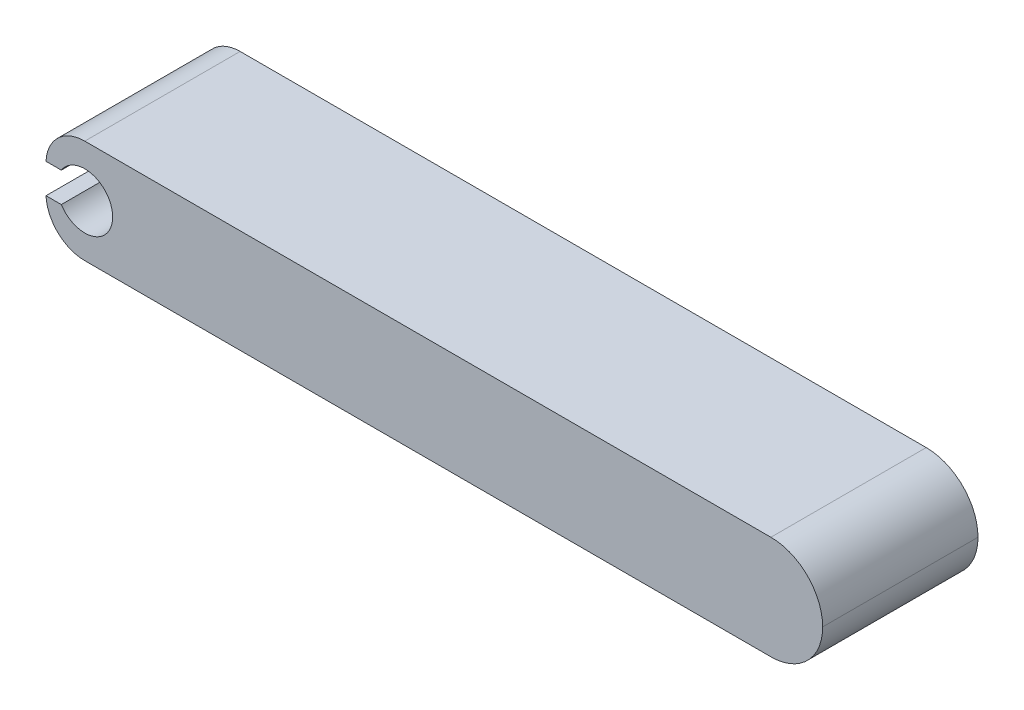
ISO-10303-21;
HEADER;
FILE_DESCRIPTION(('STEP AP214'),'2;1');
FILE_NAME('part.step','',(''),(''),'','','');
FILE_SCHEMA(('AUTOMOTIVE_DESIGN { 1 0 10303 214 1 1 1 1 }'));
ENDSEC;
DATA;
#1=APPLICATION_CONTEXT('core data for automotive mechanical design processes');
#2=APPLICATION_PROTOCOL_DEFINITION('international standard','automotive_design',2000,#1);
#3=PRODUCT_CONTEXT('',#1,'mechanical');
#4=PRODUCT('Part','Part','',(#3));
#5=PRODUCT_RELATED_PRODUCT_CATEGORY('part','',(#4));
#6=PRODUCT_DEFINITION_FORMATION('','',#4);
#7=PRODUCT_DEFINITION_CONTEXT('part definition',#1,'design');
#8=PRODUCT_DEFINITION('design','',#6,#7);
#9=PRODUCT_DEFINITION_SHAPE('','',#8);
#10=(LENGTH_UNIT() NAMED_UNIT(*) SI_UNIT(.MILLI.,.METRE.));
#11=(NAMED_UNIT(*) PLANE_ANGLE_UNIT() SI_UNIT($,.RADIAN.));
#12=(NAMED_UNIT(*) SI_UNIT($,.STERADIAN.) SOLID_ANGLE_UNIT());
#13=UNCERTAINTY_MEASURE_WITH_UNIT(LENGTH_MEASURE(1.E-05),#10,'distance_accuracy_value','');
#14=(GEOMETRIC_REPRESENTATION_CONTEXT(3) GLOBAL_UNCERTAINTY_ASSIGNED_CONTEXT((#13)) GLOBAL_UNIT_ASSIGNED_CONTEXT((#10,
#11,#12)) REPRESENTATION_CONTEXT('',''));
#15=CARTESIAN_POINT('',(0.,0.,0.));
#16=DIRECTION('',(0.,0.,1.));
#17=DIRECTION('',(1.,0.,0.));
#18=AXIS2_PLACEMENT_3D('',#15,#16,#17);
#19=CARTESIAN_POINT('',(0.,0.,12.));
#20=DIRECTION('',(0.,1.,0.));
#21=DIRECTION('',(0.,0.,1.));
#22=AXIS2_PLACEMENT_3D('',#19,#20,#21);
#23=PLANE('',#22);
#24=DIRECTION('',(1.,0.,0.));
#25=VECTOR('',#24,1.);
#26=CARTESIAN_POINT('',(0.,0.,12.));
#27=LINE('',#26,#25);
#28=CARTESIAN_POINT('',(2.99624765331573,0.,12.));
#29=VERTEX_POINT('',#28);
#30=CARTESIAN_POINT('',(56.,0.,12.));
#31=VERTEX_POINT('',#30);
#32=EDGE_CURVE('E144',#29,#31,#27,.T.);
#33=ORIENTED_EDGE('',*,*,#32,.F.);
#34=DIRECTION('',(0.,0.,-1.));
#35=VECTOR('',#34,1.);
#36=CARTESIAN_POINT('',(2.99624765331573,0.,12.));
#37=LINE('',#36,#35);
#38=CARTESIAN_POINT('',(2.99624765331573,0.,0.));
#39=VERTEX_POINT('',#38);
#40=EDGE_CURVE('E168',#29,#39,#37,.T.);
#41=ORIENTED_EDGE('',*,*,#40,.T.);
#42=DIRECTION('',(1.,0.,0.));
#43=VECTOR('',#42,1.);
#44=CARTESIAN_POINT('',(0.,0.,0.));
#45=LINE('',#44,#43);
#46=CARTESIAN_POINT('',(56.,0.,0.));
#47=VERTEX_POINT('',#46);
#48=EDGE_CURVE('E110',#39,#47,#45,.T.);
#49=ORIENTED_EDGE('',*,*,#48,.T.);
#50=DIRECTION('',(0.,0.,-1.));
#51=VECTOR('',#50,1.);
#52=CARTESIAN_POINT('',(56.,0.,12.));
#53=LINE('',#52,#51);
#54=EDGE_CURVE('E159',#47,#31,#53,.F.);
#55=ORIENTED_EDGE('',*,*,#54,.T.);
#56=EDGE_LOOP('',(#33,#41,#49,#55));
#57=FACE_BOUND('',#56,.T.);
#58=ADVANCED_FACE('F33',(#57),#23,.F.);
#59=CARTESIAN_POINT('',(0.,8.,12.));
#60=DIRECTION('',(0.,-1.,0.));
#61=DIRECTION('',(0.,0.,-1.));
#62=AXIS2_PLACEMENT_3D('',#59,#60,#61);
#63=PLANE('',#62);
#64=DIRECTION('',(-1.,0.,0.));
#65=VECTOR('',#64,1.);
#66=CARTESIAN_POINT('',(0.,8.,0.));
#67=LINE('',#66,#65);
#68=CARTESIAN_POINT('',(56.,8.,0.));
#69=VERTEX_POINT('',#68);
#70=CARTESIAN_POINT('',(2.99624765331573,8.,0.));
#71=VERTEX_POINT('',#70);
#72=EDGE_CURVE('E147',#69,#71,#67,.T.);
#73=ORIENTED_EDGE('',*,*,#72,.T.);
#74=DIRECTION('',(0.,0.,1.));
#75=VECTOR('',#74,1.);
#76=CARTESIAN_POINT('',(2.99624765331573,8.,12.));
#77=LINE('',#76,#75);
#78=CARTESIAN_POINT('',(2.99624765331573,8.,12.));
#79=VERTEX_POINT('',#78);
#80=EDGE_CURVE('E11',#71,#79,#77,.T.);
#81=ORIENTED_EDGE('',*,*,#80,.T.);
#82=DIRECTION('',(-1.,0.,0.));
#83=VECTOR('',#82,1.);
#84=CARTESIAN_POINT('',(0.,8.,12.));
#85=LINE('',#84,#83);
#86=CARTESIAN_POINT('',(56.,8.,12.));
#87=VERTEX_POINT('',#86);
#88=EDGE_CURVE('E146',#87,#79,#85,.T.);
#89=ORIENTED_EDGE('',*,*,#88,.F.);
#90=DIRECTION('',(0.,0.,-1.));
#91=VECTOR('',#90,1.);
#92=CARTESIAN_POINT('',(56.,8.,12.));
#93=LINE('',#92,#91);
#94=EDGE_CURVE('E166',#87,#69,#93,.T.);
#95=ORIENTED_EDGE('',*,*,#94,.T.);
#96=EDGE_LOOP('',(#73,#81,#89,#95));
#97=FACE_BOUND('',#96,.T.);
#98=ADVANCED_FACE('F188',(#97),#63,.F.);
#99=CARTESIAN_POINT('',(0.,0.,12.));
#100=DIRECTION('',(0.,0.,-1.));
#101=DIRECTION('',(-1.,0.,0.));
#102=AXIS2_PLACEMENT_3D('',#99,#100,#101);
#103=PLANE('',#102);
#104=DIRECTION('',(-1.,0.,0.));
#105=VECTOR('',#104,1.);
#106=CARTESIAN_POINT('',(0.,2.85,12.));
#107=LINE('',#106,#105);
#108=CARTESIAN_POINT('',(1.1834097875415,2.85,12.));
#109=VERTEX_POINT('',#108);
#110=CARTESIAN_POINT('',(0.,2.85,12.));
#111=VERTEX_POINT('',#110);
#112=EDGE_CURVE('E131',#109,#111,#107,.T.);
#113=ORIENTED_EDGE('',*,*,#112,.T.);
#114=CARTESIAN_POINT('',(2.99624765331573,3.,12.));
#115=DIRECTION('',(0.,0.,-1.));
#116=DIRECTION('',(-1.,0.,0.));
#117=AXIS2_PLACEMENT_3D('',#114,#115,#116);
#118=CIRCLE('',#117,3.);
#119=EDGE_CURVE('E41',#111,#29,#118,.F.);
#120=ORIENTED_EDGE('',*,*,#119,.T.);
#121=ORIENTED_EDGE('',*,*,#32,.T.);
#122=CARTESIAN_POINT('',(56.,4.,12.));
#123=DIRECTION('',(0.,0.,-1.));
#124=DIRECTION('',(-1.,0.,0.));
#125=AXIS2_PLACEMENT_3D('',#122,#123,#124);
#126=CIRCLE('',#125,4.);
#127=CARTESIAN_POINT('',(60.,4.,12.));
#128=VERTEX_POINT('',#127);
#129=EDGE_CURVE('E164',#31,#128,#126,.F.);
#130=ORIENTED_EDGE('',*,*,#129,.T.);
#131=CARTESIAN_POINT('',(56.,4.,12.));
#132=DIRECTION('',(0.,0.,-1.));
#133=DIRECTION('',(-1.,0.,0.));
#134=AXIS2_PLACEMENT_3D('',#131,#132,#133);
#135=CIRCLE('',#134,4.);
#136=EDGE_CURVE('E162',#128,#87,#135,.F.);
#137=ORIENTED_EDGE('',*,*,#136,.T.);
#138=ORIENTED_EDGE('',*,*,#88,.T.);
#139=CARTESIAN_POINT('',(2.99624765331573,5.,12.));
#140=DIRECTION('',(0.,0.,-1.));
#141=DIRECTION('',(-1.,0.,0.));
#142=AXIS2_PLACEMENT_3D('',#139,#140,#141);
#143=CIRCLE('',#142,3.);
#144=CARTESIAN_POINT('',(0.,5.15,12.));
#145=VERTEX_POINT('',#144);
#146=EDGE_CURVE('E115',#79,#145,#143,.F.);
#147=ORIENTED_EDGE('',*,*,#146,.T.);
#148=DIRECTION('',(1.,0.,0.));
#149=VECTOR('',#148,1.);
#150=CARTESIAN_POINT('',(0.,5.15,12.));
#151=LINE('',#150,#149);
#152=CARTESIAN_POINT('',(1.1834097875415,5.15,12.));
#153=VERTEX_POINT('',#152);
#154=EDGE_CURVE('E136',#145,#153,#151,.T.);
#155=ORIENTED_EDGE('',*,*,#154,.T.);
#156=CARTESIAN_POINT('',(3.,4.,12.));
#157=DIRECTION('',(0.,0.,-1.));
#158=DIRECTION('',(-1.,0.,0.));
#159=AXIS2_PLACEMENT_3D('',#156,#157,#158);
#160=CIRCLE('',#159,2.15);
#161=EDGE_CURVE('E141',#153,#109,#160,.T.);
#162=ORIENTED_EDGE('',*,*,#161,.T.);
#163=EDGE_LOOP('',(#113,#120,#121,#130,#137,#138,#147,#155,#162));
#164=FACE_BOUND('',#163,.T.);
#165=ADVANCED_FACE('F175',(#164),#103,.F.);
#166=CARTESIAN_POINT('',(0.,0.,0.));
#167=DIRECTION('',(0.,0.,-1.));
#168=DIRECTION('',(-1.,0.,0.));
#169=AXIS2_PLACEMENT_3D('',#166,#167,#168);
#170=PLANE('',#169);
#171=ORIENTED_EDGE('',*,*,#48,.F.);
#172=CARTESIAN_POINT('',(2.99624765331573,3.,0.));
#173=DIRECTION('',(0.,0.,-1.));
#174=DIRECTION('',(-1.,0.,0.));
#175=AXIS2_PLACEMENT_3D('',#172,#173,#174);
#176=CIRCLE('',#175,3.);
#177=CARTESIAN_POINT('',(0.,2.85,0.));
#178=VERTEX_POINT('',#177);
#179=EDGE_CURVE('E103',#39,#178,#176,.T.);
#180=ORIENTED_EDGE('',*,*,#179,.T.);
#181=DIRECTION('',(1.,0.,0.));
#182=VECTOR('',#181,1.);
#183=CARTESIAN_POINT('',(0.,2.85,0.));
#184=LINE('',#183,#182);
#185=CARTESIAN_POINT('',(1.1834097875415,2.85,0.));
#186=VERTEX_POINT('',#185);
#187=EDGE_CURVE('E107',#178,#186,#184,.T.);
#188=ORIENTED_EDGE('',*,*,#187,.T.);
#189=CARTESIAN_POINT('',(3.,4.,0.));
#190=DIRECTION('',(0.,0.,1.));
#191=DIRECTION('',(1.,0.,0.));
#192=AXIS2_PLACEMENT_3D('',#189,#190,#191);
#193=CIRCLE('',#192,2.15);
#194=CARTESIAN_POINT('',(1.1834097875415,5.15,0.));
#195=VERTEX_POINT('',#194);
#196=EDGE_CURVE('E139',#186,#195,#193,.T.);
#197=ORIENTED_EDGE('',*,*,#196,.T.);
#198=DIRECTION('',(-1.,0.,0.));
#199=VECTOR('',#198,1.);
#200=CARTESIAN_POINT('',(0.,5.15,0.));
#201=LINE('',#200,#199);
#202=CARTESIAN_POINT('',(0.,5.15,0.));
#203=VERTEX_POINT('',#202);
#204=EDGE_CURVE('E123',#195,#203,#201,.T.);
#205=ORIENTED_EDGE('',*,*,#204,.T.);
#206=CARTESIAN_POINT('',(2.99624765331573,5.,0.));
#207=DIRECTION('',(0.,0.,-1.));
#208=DIRECTION('',(-1.,0.,0.));
#209=AXIS2_PLACEMENT_3D('',#206,#207,#208);
#210=CIRCLE('',#209,3.);
#211=EDGE_CURVE('E54',#203,#71,#210,.T.);
#212=ORIENTED_EDGE('',*,*,#211,.T.);
#213=ORIENTED_EDGE('',*,*,#72,.F.);
#214=CARTESIAN_POINT('',(56.,4.,0.));
#215=DIRECTION('',(0.,0.,-1.));
#216=DIRECTION('',(-1.,0.,0.));
#217=AXIS2_PLACEMENT_3D('',#214,#215,#216);
#218=CIRCLE('',#217,4.);
#219=CARTESIAN_POINT('',(60.,4.,0.));
#220=VERTEX_POINT('',#219);
#221=EDGE_CURVE('E155',#69,#220,#218,.T.);
#222=ORIENTED_EDGE('',*,*,#221,.T.);
#223=CARTESIAN_POINT('',(56.,4.,0.));
#224=DIRECTION('',(0.,0.,-1.));
#225=DIRECTION('',(-1.,0.,0.));
#226=AXIS2_PLACEMENT_3D('',#223,#224,#225);
#227=CIRCLE('',#226,4.);
#228=EDGE_CURVE('E157',#220,#47,#227,.T.);
#229=ORIENTED_EDGE('',*,*,#228,.T.);
#230=EDGE_LOOP('',(#171,#180,#188,#197,#205,#212,#213,#222,#229));
#231=FACE_BOUND('',#230,.T.);
#232=ADVANCED_FACE('F105',(#231),#170,.T.);
#233=CARTESIAN_POINT('',(3.,4.,0.));
#234=DIRECTION('',(0.,0.,1.));
#235=DIRECTION('',(1.,0.,0.));
#236=AXIS2_PLACEMENT_3D('',#233,#234,#235);
#237=CYLINDRICAL_SURFACE('',#236,2.15);
#238=ORIENTED_EDGE('',*,*,#161,.F.);
#239=DIRECTION('',(0.,0.,1.));
#240=VECTOR('',#239,1.);
#241=CARTESIAN_POINT('',(1.1834097875415,5.15,0.));
#242=LINE('',#241,#240);
#243=EDGE_CURVE('E152',#153,#195,#242,.F.);
#244=ORIENTED_EDGE('',*,*,#243,.T.);
#245=ORIENTED_EDGE('',*,*,#196,.F.);
#246=DIRECTION('',(0.,0.,1.));
#247=VECTOR('',#246,1.);
#248=CARTESIAN_POINT('',(1.1834097875415,2.85,0.));
#249=LINE('',#248,#247);
#250=EDGE_CURVE('E122',#186,#109,#249,.T.);
#251=ORIENTED_EDGE('',*,*,#250,.T.);
#252=EDGE_LOOP('',(#238,#244,#245,#251));
#253=FACE_BOUND('',#252,.T.);
#254=ADVANCED_FACE('F197',(#253),#237,.F.);
#255=CARTESIAN_POINT('',(0.,2.85,0.));
#256=DIRECTION('',(0.,-1.,0.));
#257=DIRECTION('',(0.,0.,-1.));
#258=AXIS2_PLACEMENT_3D('',#255,#256,#257);
#259=PLANE('',#258);
#260=ORIENTED_EDGE('',*,*,#250,.F.);
#261=ORIENTED_EDGE('',*,*,#187,.F.);
#262=DIRECTION('',(0.,0.,1.));
#263=VECTOR('',#262,1.);
#264=CARTESIAN_POINT('',(0.,2.85,0.));
#265=LINE('',#264,#263);
#266=EDGE_CURVE('E119',#178,#111,#265,.T.);
#267=ORIENTED_EDGE('',*,*,#266,.T.);
#268=ORIENTED_EDGE('',*,*,#112,.F.);
#269=EDGE_LOOP('',(#260,#261,#267,#268));
#270=FACE_BOUND('',#269,.T.);
#271=ADVANCED_FACE('F118',(#270),#259,.F.);
#272=CARTESIAN_POINT('',(0.,5.15,0.));
#273=DIRECTION('',(0.,1.,0.));
#274=DIRECTION('',(0.,0.,1.));
#275=AXIS2_PLACEMENT_3D('',#272,#273,#274);
#276=PLANE('',#275);
#277=DIRECTION('',(0.,0.,1.));
#278=VECTOR('',#277,1.);
#279=CARTESIAN_POINT('',(0.,5.15,0.));
#280=LINE('',#279,#278);
#281=EDGE_CURVE('E128',#203,#145,#280,.T.);
#282=ORIENTED_EDGE('',*,*,#281,.F.);
#283=ORIENTED_EDGE('',*,*,#204,.F.);
#284=ORIENTED_EDGE('',*,*,#243,.F.);
#285=ORIENTED_EDGE('',*,*,#154,.F.);
#286=EDGE_LOOP('',(#282,#283,#284,#285));
#287=FACE_BOUND('',#286,.T.);
#288=ADVANCED_FACE('F194',(#287),#276,.F.);
#289=CARTESIAN_POINT('',(56.,4.,12.));
#290=DIRECTION('',(0.,0.,-1.));
#291=DIRECTION('',(-1.,0.,0.));
#292=AXIS2_PLACEMENT_3D('',#289,#290,#291);
#293=CYLINDRICAL_SURFACE('',#292,4.);
#294=ORIENTED_EDGE('',*,*,#94,.F.);
#295=ORIENTED_EDGE('',*,*,#136,.F.);
#296=DIRECTION('',(0.,0.,-1.));
#297=VECTOR('',#296,1.);
#298=CARTESIAN_POINT('',(60.,4.,12.));
#299=LINE('',#298,#297);
#300=EDGE_CURVE('E124',#220,#128,#299,.F.);
#301=ORIENTED_EDGE('',*,*,#300,.F.);
#302=ORIENTED_EDGE('',*,*,#221,.F.);
#303=EDGE_LOOP('',(#294,#295,#301,#302));
#304=FACE_BOUND('',#303,.T.);
#305=ADVANCED_FACE('F186',(#304),#293,.T.);
#306=CARTESIAN_POINT('',(56.,4.,12.));
#307=DIRECTION('',(0.,0.,-1.));
#308=DIRECTION('',(-1.,0.,0.));
#309=AXIS2_PLACEMENT_3D('',#306,#307,#308);
#310=CYLINDRICAL_SURFACE('',#309,4.);
#311=ORIENTED_EDGE('',*,*,#129,.F.);
#312=ORIENTED_EDGE('',*,*,#54,.F.);
#313=ORIENTED_EDGE('',*,*,#228,.F.);
#314=ORIENTED_EDGE('',*,*,#300,.T.);
#315=EDGE_LOOP('',(#311,#312,#313,#314));
#316=FACE_BOUND('',#315,.T.);
#317=ADVANCED_FACE('F181',(#316),#310,.T.);
#318=CARTESIAN_POINT('',(2.99624765331573,3.,12.));
#319=DIRECTION('',(0.,0.,-1.));
#320=DIRECTION('',(-1.,0.,0.));
#321=AXIS2_PLACEMENT_3D('',#318,#319,#320);
#322=CYLINDRICAL_SURFACE('',#321,3.);
#323=ORIENTED_EDGE('',*,*,#119,.F.);
#324=ORIENTED_EDGE('',*,*,#266,.F.);
#325=ORIENTED_EDGE('',*,*,#179,.F.);
#326=ORIENTED_EDGE('',*,*,#40,.F.);
#327=EDGE_LOOP('',(#323,#324,#325,#326));
#328=FACE_BOUND('',#327,.T.);
#329=ADVANCED_FACE('F127',(#328),#322,.T.);
#330=CARTESIAN_POINT('',(2.99624765331573,5.,12.));
#331=DIRECTION('',(0.,0.,1.));
#332=DIRECTION('',(1.,0.,0.));
#333=AXIS2_PLACEMENT_3D('',#330,#331,#332);
#334=CYLINDRICAL_SURFACE('',#333,3.);
#335=ORIENTED_EDGE('',*,*,#146,.F.);
#336=ORIENTED_EDGE('',*,*,#80,.F.);
#337=ORIENTED_EDGE('',*,*,#211,.F.);
#338=ORIENTED_EDGE('',*,*,#281,.T.);
#339=EDGE_LOOP('',(#335,#336,#337,#338));
#340=FACE_BOUND('',#339,.T.);
#341=ADVANCED_FACE('F35',(#340),#334,.T.);
#342=CLOSED_SHELL('',(#58,#98,#165,#232,#254,#271,#288,#305,#317,#329,#341));
#343=MANIFOLD_SOLID_BREP('B2',#342);
#344=ADVANCED_BREP_SHAPE_REPRESENTATION('',(#18,#343),#14);
#345=SHAPE_DEFINITION_REPRESENTATION(#9,#344);
ENDSEC;
END-ISO-10303-21;
